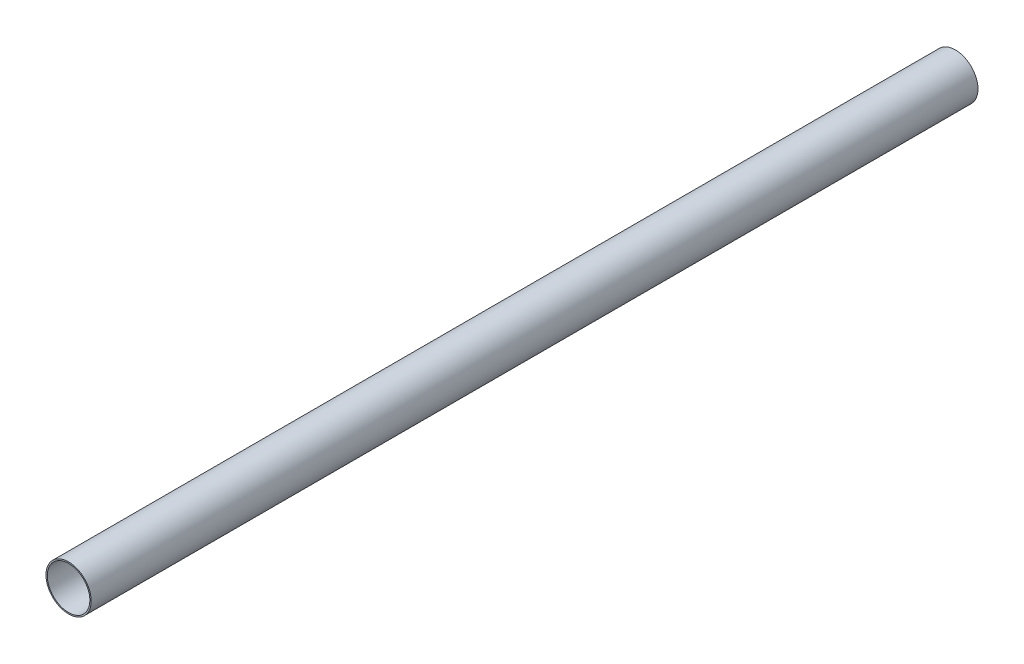
ISO-10303-21;
HEADER;
FILE_DESCRIPTION(('STEP AP214'),'2;1');
FILE_NAME('part.step','',(''),(''),'','','');
FILE_SCHEMA(('AUTOMOTIVE_DESIGN { 1 0 10303 214 1 1 1 1 }'));
ENDSEC;
DATA;
#1=APPLICATION_CONTEXT('core data for automotive mechanical design processes');
#2=APPLICATION_PROTOCOL_DEFINITION('international standard','automotive_design',2000,#1);
#3=PRODUCT_CONTEXT('',#1,'mechanical');
#4=PRODUCT('Part','Part','',(#3));
#5=PRODUCT_RELATED_PRODUCT_CATEGORY('part','',(#4));
#6=PRODUCT_DEFINITION_FORMATION('','',#4);
#7=PRODUCT_DEFINITION_CONTEXT('part definition',#1,'design');
#8=PRODUCT_DEFINITION('design','',#6,#7);
#9=PRODUCT_DEFINITION_SHAPE('','',#8);
#10=(LENGTH_UNIT() NAMED_UNIT(*) SI_UNIT(.MILLI.,.METRE.));
#11=(NAMED_UNIT(*) PLANE_ANGLE_UNIT() SI_UNIT($,.RADIAN.));
#12=(NAMED_UNIT(*) SI_UNIT($,.STERADIAN.) SOLID_ANGLE_UNIT());
#13=UNCERTAINTY_MEASURE_WITH_UNIT(LENGTH_MEASURE(1.E-05),#10,'distance_accuracy_value','');
#14=(GEOMETRIC_REPRESENTATION_CONTEXT(3) GLOBAL_UNCERTAINTY_ASSIGNED_CONTEXT((#13)) GLOBAL_UNIT_ASSIGNED_CONTEXT((#10,
#11,#12)) REPRESENTATION_CONTEXT('',''));
#15=CARTESIAN_POINT('',(0.,0.,0.));
#16=DIRECTION('',(0.,0.,1.));
#17=DIRECTION('',(1.,0.,0.));
#18=AXIS2_PLACEMENT_3D('',#15,#16,#17);
#19=CARTESIAN_POINT('',(0.,0.,500.));
#20=DIRECTION('',(0.,0.,1.));
#21=DIRECTION('',(1.,0.,0.));
#22=AXIS2_PLACEMENT_3D('',#19,#20,#21);
#23=PLANE('',#22);
#24=CARTESIAN_POINT('',(0.,0.,500.));
#25=DIRECTION('',(0.,0.,1.));
#26=DIRECTION('',(1.,0.,0.));
#27=AXIS2_PLACEMENT_3D('',#24,#25,#26);
#28=CIRCLE('',#27,25.5);
#29=CARTESIAN_POINT('',(25.5,0.,500.));
#30=VERTEX_POINT('',#29);
#31=EDGE_CURVE('E10',#30,#30,#28,.T.);
#32=ORIENTED_EDGE('',*,*,#31,.T.);
#33=EDGE_LOOP('',(#32));
#34=FACE_BOUND('',#33,.T.);
#35=CARTESIAN_POINT('',(0.,0.,500.));
#36=DIRECTION('',(0.,0.,1.));
#37=DIRECTION('',(1.,0.,0.));
#38=AXIS2_PLACEMENT_3D('',#35,#36,#37);
#39=CIRCLE('',#38,24.);
#40=CARTESIAN_POINT('',(24.,0.,500.));
#41=VERTEX_POINT('',#40);
#42=EDGE_CURVE('E54',#41,#41,#39,.T.);
#43=ORIENTED_EDGE('',*,*,#42,.F.);
#44=EDGE_LOOP('',(#43));
#45=FACE_BOUND('',#44,.T.);
#46=ADVANCED_FACE('F41',(#34,#45),#23,.T.);
#47=CARTESIAN_POINT('',(0.,0.,-500.));
#48=DIRECTION('',(0.,0.,1.));
#49=DIRECTION('',(1.,0.,0.));
#50=AXIS2_PLACEMENT_3D('',#47,#48,#49);
#51=PLANE('',#50);
#52=CARTESIAN_POINT('',(0.,0.,-500.));
#53=DIRECTION('',(0.,0.,1.));
#54=DIRECTION('',(1.,0.,0.));
#55=AXIS2_PLACEMENT_3D('',#52,#53,#54);
#56=CIRCLE('',#55,25.5);
#57=CARTESIAN_POINT('',(25.5,0.,-500.));
#58=VERTEX_POINT('',#57);
#59=EDGE_CURVE('E45',#58,#58,#56,.T.);
#60=ORIENTED_EDGE('',*,*,#59,.F.);
#61=EDGE_LOOP('',(#60));
#62=FACE_BOUND('',#61,.T.);
#63=CARTESIAN_POINT('',(0.,0.,-500.));
#64=DIRECTION('',(0.,0.,1.));
#65=DIRECTION('',(1.,0.,0.));
#66=AXIS2_PLACEMENT_3D('',#63,#64,#65);
#67=CIRCLE('',#66,24.);
#68=CARTESIAN_POINT('',(24.,0.,-500.));
#69=VERTEX_POINT('',#68);
#70=EDGE_CURVE('E56',#69,#69,#67,.T.);
#71=ORIENTED_EDGE('',*,*,#70,.T.);
#72=EDGE_LOOP('',(#71));
#73=FACE_BOUND('',#72,.T.);
#74=ADVANCED_FACE('F68',(#62,#73),#51,.F.);
#75=CARTESIAN_POINT('',(0.,0.,500.));
#76=DIRECTION('',(0.,0.,-1.));
#77=DIRECTION('',(-1.,0.,0.));
#78=AXIS2_PLACEMENT_3D('',#75,#76,#77);
#79=CYLINDRICAL_SURFACE('',#78,25.5);
#80=ORIENTED_EDGE('',*,*,#31,.F.);
#81=EDGE_LOOP('',(#80));
#82=FACE_BOUND('',#81,.T.);
#83=ORIENTED_EDGE('',*,*,#59,.T.);
#84=EDGE_LOOP('',(#83));
#85=FACE_BOUND('',#84,.T.);
#86=ADVANCED_FACE('F43',(#82,#85),#79,.T.);
#87=CARTESIAN_POINT('',(0.,0.,500.));
#88=DIRECTION('',(0.,0.,-1.));
#89=DIRECTION('',(-1.,0.,0.));
#90=AXIS2_PLACEMENT_3D('',#87,#88,#89);
#91=CYLINDRICAL_SURFACE('',#90,24.);
#92=ORIENTED_EDGE('',*,*,#42,.T.);
#93=EDGE_LOOP('',(#92));
#94=FACE_BOUND('',#93,.T.);
#95=ORIENTED_EDGE('',*,*,#70,.F.);
#96=EDGE_LOOP('',(#95));
#97=FACE_BOUND('',#96,.T.);
#98=ADVANCED_FACE('F64',(#94,#97),#91,.F.);
#99=CLOSED_SHELL('',(#46,#74,#86,#98));
#100=MANIFOLD_SOLID_BREP('B2',#99);
#101=ADVANCED_BREP_SHAPE_REPRESENTATION('',(#18,#100),#14);
#102=SHAPE_DEFINITION_REPRESENTATION(#9,#101);
ENDSEC;
END-ISO-10303-21;
